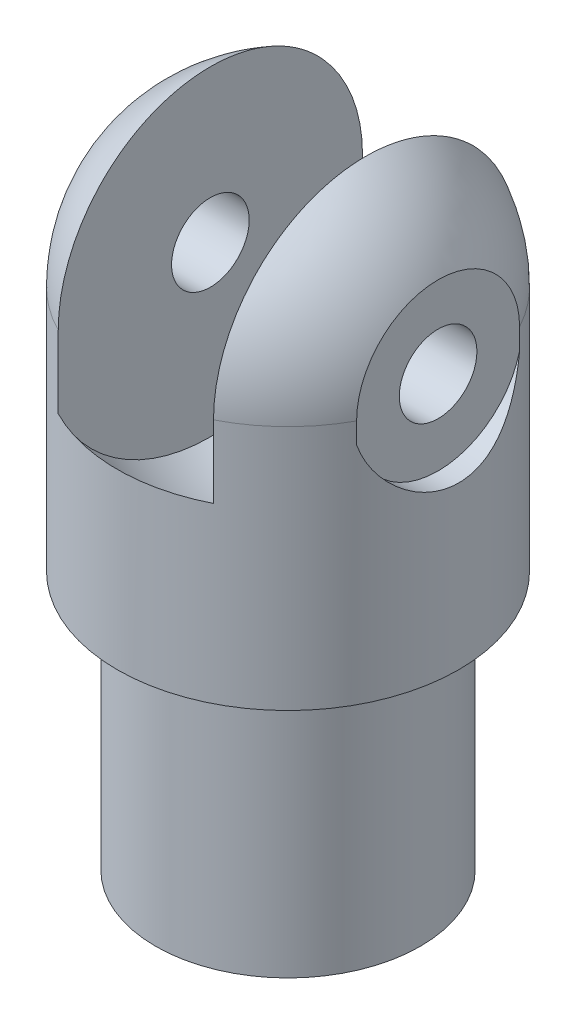
ISO-10303-21;
HEADER;
FILE_DESCRIPTION(('STEP AP214'),'2;1');
FILE_NAME('part.step','',(''),(''),'','','');
FILE_SCHEMA(('AUTOMOTIVE_DESIGN { 1 0 10303 214 1 1 1 1 }'));
ENDSEC;
DATA;
#1=APPLICATION_CONTEXT('core data for automotive mechanical design processes');
#2=APPLICATION_PROTOCOL_DEFINITION('international standard','automotive_design',2000,#1);
#3=PRODUCT_CONTEXT('',#1,'mechanical');
#4=PRODUCT('Part','Part','',(#3));
#5=PRODUCT_RELATED_PRODUCT_CATEGORY('part','',(#4));
#6=PRODUCT_DEFINITION_FORMATION('','',#4);
#7=PRODUCT_DEFINITION_CONTEXT('part definition',#1,'design');
#8=PRODUCT_DEFINITION('design','',#6,#7);
#9=PRODUCT_DEFINITION_SHAPE('','',#8);
#10=(LENGTH_UNIT() NAMED_UNIT(*) SI_UNIT(.MILLI.,.METRE.));
#11=(NAMED_UNIT(*) PLANE_ANGLE_UNIT() SI_UNIT($,.RADIAN.));
#12=(NAMED_UNIT(*) SI_UNIT($,.STERADIAN.) SOLID_ANGLE_UNIT());
#13=UNCERTAINTY_MEASURE_WITH_UNIT(LENGTH_MEASURE(1.E-05),#10,'distance_accuracy_value','');
#14=(GEOMETRIC_REPRESENTATION_CONTEXT(3) GLOBAL_UNCERTAINTY_ASSIGNED_CONTEXT((#13)) GLOBAL_UNIT_ASSIGNED_CONTEXT((#10,
#11,#12)) REPRESENTATION_CONTEXT('',''));
#15=CARTESIAN_POINT('',(0.,0.,0.));
#16=DIRECTION('',(0.,0.,1.));
#17=DIRECTION('',(1.,0.,0.));
#18=AXIS2_PLACEMENT_3D('',#15,#16,#17);
#19=CARTESIAN_POINT('',(0.,25.4,0.));
#20=DIRECTION('',(0.,-1.,0.));
#21=DIRECTION('',(0.,0.,-1.));
#22=AXIS2_PLACEMENT_3D('',#19,#20,#21);
#23=CYLINDRICAL_SURFACE('',#22,16.764);
#24=CARTESIAN_POINT('',(0.,25.4,0.));
#25=DIRECTION('',(0.,-1.,0.));
#26=DIRECTION('',(0.,0.,-1.));
#27=AXIS2_PLACEMENT_3D('',#24,#25,#26);
#28=CIRCLE('',#27,16.764);
#29=CARTESIAN_POINT('',(0.,25.4,-16.764));
#30=VERTEX_POINT('',#29);
#31=EDGE_CURVE('E155',#30,#30,#28,.T.);
#32=ORIENTED_EDGE('',*,*,#31,.F.);
#33=EDGE_LOOP('',(#32));
#34=FACE_BOUND('',#33,.T.);
#35=DIRECTION('',(0.,-1.,0.));
#36=VECTOR('',#35,1.);
#37=CARTESIAN_POINT('',(-14.732,25.4,7.99999199999601));
#38=LINE('',#37,#36);
#39=CARTESIAN_POINT('',(-14.732,49.53,7.99999199999599));
#40=VERTEX_POINT('',#39);
#41=CARTESIAN_POINT('',(-14.732,47.4940351181811,7.999991999996));
#42=VERTEX_POINT('',#41);
#43=EDGE_CURVE('E54',#40,#42,#38,.T.);
#44=ORIENTED_EDGE('',*,*,#43,.T.);
#45=CARTESIAN_POINT('',(-14.732,47.4940351181811,7.999991999996));
#46=CARTESIAN_POINT('',(-14.7632428149745,47.2676965830814,7.94241358215981));
#47=CARTESIAN_POINT('',(-14.7992408390983,47.0445110768314,7.87536493698053));
#48=CARTESIAN_POINT('',(-14.879188313626,46.6060089675617,7.72327688875927));
#49=CARTESIAN_POINT('',(-14.9231316908732,46.39068650436,7.6382512183925));
#50=CARTESIAN_POINT('',(-15.0173193540466,45.9697669038307,7.45135367046158));
#51=CARTESIAN_POINT('',(-15.0675440290785,45.7641421273517,7.34953392338279));
#52=CARTESIAN_POINT('',(-15.172784570775,45.3629649693112,7.12973781880571));
#53=CARTESIAN_POINT('',(-15.2278013555183,45.1674145292753,7.01175836291917));
#54=CARTESIAN_POINT('',(-15.3408377940109,44.7879154803039,6.7608624749813));
#55=CARTESIAN_POINT('',(-15.3988485487307,44.6039357301417,6.62798907245141));
#56=CARTESIAN_POINT('',(-15.5164536502358,44.247772245364,6.34779121039095));
#57=CARTESIAN_POINT('',(-15.576048519683,44.0755924727903,6.20046193704368));
#58=CARTESIAN_POINT('',(-15.6953215393529,43.7437713667053,5.89202328109875));
#59=CARTESIAN_POINT('',(-15.7549997161271,43.5841415256537,5.73090154380131));
#60=CARTESIAN_POINT('',(-15.8728994383717,43.2784275593615,5.39576817693684));
#61=CARTESIAN_POINT('',(-15.9311208999466,43.1323442129878,5.22175580724551));
#62=CARTESIAN_POINT('',(-16.0478628509385,42.8468007347405,4.85155017999724));
#63=CARTESIAN_POINT('',(-16.1062164025846,42.7081736847849,4.65466002551559));
#64=CARTESIAN_POINT('',(-16.2180568804278,42.4481591991597,4.24860570896111));
#65=CARTESIAN_POINT('',(-16.271545758772,42.3267648371098,4.03944652625551));
#66=CARTESIAN_POINT('',(-16.3721474970255,42.1023081457724,3.61013350428588));
#67=CARTESIAN_POINT('',(-16.419262715903,41.9992390296273,3.38998377428444));
#68=CARTESIAN_POINT('',(-16.5057477863901,41.8124944270932,2.9401400339747));
#69=CARTESIAN_POINT('',(-16.545118332013,41.7288172028441,2.71044688110503));
#70=CARTESIAN_POINT('',(-16.6128116427845,41.5862899211255,2.25731556721498));
#71=CARTESIAN_POINT('',(-16.6416555412932,41.5262514704973,2.03432900370458));
#72=CARTESIAN_POINT('',(-16.6906167773421,41.4249405685363,1.58318479412128));
#73=CARTESIAN_POINT('',(-16.710734420957,41.383667459004,1.35502732971389));
#74=CARTESIAN_POINT('',(-16.7416457550054,41.3204450568566,0.895538072447009));
#75=CARTESIAN_POINT('',(-16.752444102877,41.2984861116337,0.664207923970672));
#76=CARTESIAN_POINT('',(-16.7644091112563,41.2741622096633,0.200277254742219));
#77=CARTESIAN_POINT('',(-16.7655764400388,41.2717958934271,-0.0323231767470658));
#78=CARTESIAN_POINT('',(-16.7585774682984,41.286015963006,-0.475925150939787));
#79=CARTESIAN_POINT('',(-16.7512374738537,41.3009244339688,-0.686995954489339));
#80=CARTESIAN_POINT('',(-16.7287341668824,41.3468296178267,-1.10696138492675));
#81=CARTESIAN_POINT('',(-16.7135708234282,41.3778263943229,-1.31585600320827));
#82=CARTESIAN_POINT('',(-16.675793299344,41.4555611276885,-1.72998501250151));
#83=CARTESIAN_POINT('',(-16.6531797037887,41.5022978484928,-1.93521968959792));
#84=CARTESIAN_POINT('',(-16.6010418636704,41.6110232478168,-2.34070499905829));
#85=CARTESIAN_POINT('',(-16.5715174082148,41.6730123917843,-2.54095547911752));
#86=CARTESIAN_POINT('',(-16.5061109356301,41.8119173696252,-2.93602248687384));
#87=CARTESIAN_POINT('',(-16.4702050376366,41.8888893797212,-3.1308153054206));
#88=CARTESIAN_POINT('',(-16.3929194386841,42.0569362686502,-3.51311679042389));
#89=CARTESIAN_POINT('',(-16.351538025052,42.1480155615923,-3.70062315393017));
#90=CARTESIAN_POINT('',(-16.2204913759469,42.4413852655865,-4.25078418897575));
#91=CARTESIAN_POINT('',(-16.1238963619702,42.6638638179334,-4.60123949546831));
#92=CARTESIAN_POINT('',(-15.911072723423,43.1789899949749,-5.29262327700382));
#93=CARTESIAN_POINT('',(-15.7938609473103,43.4761316921131,-5.62990125852566));
#94=CARTESIAN_POINT('',(-15.6172315949704,43.9592130610402,-6.09602565455538));
#95=CARTESIAN_POINT('',(-15.5582044904555,44.1265164317535,-6.24480168645756));
#96=CARTESIAN_POINT('',(-15.4413018385372,44.4729525759345,-6.52850608220802));
#97=CARTESIAN_POINT('',(-15.3834263932282,44.652086392143,-6.66343322272471));
#98=CARTESIAN_POINT('',(-15.2660021267702,45.0355624724045,-6.92845533405348));
#99=CARTESIAN_POINT('',(-15.2066682552839,45.2407834857071,-7.05737592431754));
#100=CARTESIAN_POINT('',(-15.0930610282224,45.6628134689172,-7.29717698972182));
#101=CARTESIAN_POINT('',(-15.0387869161287,45.8796206988409,-7.40806016360996));
#102=CARTESIAN_POINT('',(-14.9370883073101,46.3242571421849,-7.61105063455357));
#103=CARTESIAN_POINT('',(-14.8896848786245,46.5521175119135,-7.70310052277909));
#104=CARTESIAN_POINT('',(-14.803725968713,47.016802057885,-7.8670033936605));
#105=CARTESIAN_POINT('',(-14.7651777545342,47.253633411848,-7.9388397988814));
#106=CARTESIAN_POINT('',(-14.732,47.4940351181811,-7.99999199999601));
#107=B_SPLINE_CURVE_WITH_KNOTS('',3,(#45,#46,#47,#48,#49,#50,#51,#52,#53,#54,#55,#56,#57,#58,
#59,#60,#61,#62,#63,#64,#65,#66,#67,#68,#69,#70,#71,#72,#73,#74,#75,#76,#77,#78,#79,#80,#81,#82,
#83,#84,#85,#86,#87,#88,#89,#90,#91,#92,#93,#94,#95,#96,#97,#98,#99,#100,#101,#102,#103,#104,
#105,#106),.UNSPECIFIED.,.F.,.F.,(4,2,2,2,2,2,2,2,2,2,2,2,2,2,2,2,2,2,2,2,2,2,2,2,2,2,2,2,2,2,
4),(0.,0.706505853907137,1.4124739444298,2.11629051532642,2.8202422221719,3.52221018258879,
4.2244126973953,4.92725093241565,5.63012955268697,6.37249353165079,7.11455828028312,
7.85634762598262,8.59807046836946,9.29528988206071,9.99248483870202,10.6893311610708,
11.3861291304239,12.0205410126832,12.6549554029508,13.2893199839718,13.9237039258626,
14.5605138847824,15.1975235028742,16.4710365822318,17.8583634398683,18.552385977943,
19.2464697693201,19.9940608696873,20.7415400128165,21.491264794148,22.2416026577728),.UNSPECIFIED.);
#108=CARTESIAN_POINT('',(-14.732,47.4940351181811,-7.99999199999601));
#109=VERTEX_POINT('',#108);
#110=EDGE_CURVE('E11',#42,#109,#107,.T.);
#111=ORIENTED_EDGE('',*,*,#110,.T.);
#112=DIRECTION('',(0.,-1.,0.));
#113=VECTOR('',#112,1.);
#114=CARTESIAN_POINT('',(-14.732,25.4,-7.99999199999601));
#115=LINE('',#114,#113);
#116=CARTESIAN_POINT('',(-14.732,49.53,-7.99999199999602));
#117=VERTEX_POINT('',#116);
#118=EDGE_CURVE('E111',#109,#117,#115,.F.);
#119=ORIENTED_EDGE('',*,*,#118,.T.);
#120=CARTESIAN_POINT('',(0.,49.53,0.));
#121=DIRECTION('',(0.,-1.,0.));
#122=DIRECTION('',(0.,0.,-1.));
#123=AXIS2_PLACEMENT_3D('',#120,#121,#122);
#124=CIRCLE('',#123,16.764);
#125=CARTESIAN_POINT('',(-7.62000000000001,49.53,-14.9320894720063));
#126=VERTEX_POINT('',#125);
#127=EDGE_CURVE('E159',#117,#126,#124,.T.);
#128=ORIENTED_EDGE('',*,*,#127,.T.);
#129=DIRECTION('',(0.,-1.,0.));
#130=VECTOR('',#129,1.);
#131=CARTESIAN_POINT('',(-7.62000000000001,25.4,-14.9320894720063));
#132=LINE('',#131,#130);
#133=CARTESIAN_POINT('',(-7.62,42.4289866670171,-14.9320894720063));
#134=VERTEX_POINT('',#133);
#135=EDGE_CURVE('E148',#126,#134,#132,.T.);
#136=ORIENTED_EDGE('',*,*,#135,.T.);
#137=CARTESIAN_POINT('',(0.,42.4289866670171,0.));
#138=DIRECTION('',(0.,1.,0.));
#139=DIRECTION('',(0.,0.,1.));
#140=AXIS2_PLACEMENT_3D('',#137,#138,#139);
#141=CIRCLE('',#140,16.764);
#142=CARTESIAN_POINT('',(7.61999999999999,42.4289866670171,-14.9320894720063));
#143=VERTEX_POINT('',#142);
#144=EDGE_CURVE('E175',#143,#134,#141,.T.);
#145=ORIENTED_EDGE('',*,*,#144,.F.);
#146=DIRECTION('',(0.,-1.,0.));
#147=VECTOR('',#146,1.);
#148=CARTESIAN_POINT('',(7.61999999999998,25.4,-14.9320894720063));
#149=LINE('',#148,#147);
#150=CARTESIAN_POINT('',(7.61999999999999,49.53,-14.9320894720063));
#151=VERTEX_POINT('',#150);
#152=EDGE_CURVE('E144',#143,#151,#149,.F.);
#153=ORIENTED_EDGE('',*,*,#152,.T.);
#154=CARTESIAN_POINT('',(14.732,49.53,-7.99999199999601));
#155=VERTEX_POINT('',#154);
#156=EDGE_CURVE('E158',#151,#155,#124,.T.);
#157=ORIENTED_EDGE('',*,*,#156,.T.);
#158=DIRECTION('',(0.,-1.,0.));
#159=VECTOR('',#158,1.);
#160=CARTESIAN_POINT('',(14.732,25.4,-7.99999199999601));
#161=LINE('',#160,#159);
#162=CARTESIAN_POINT('',(14.732,47.4940351181811,-7.99999199999601));
#163=VERTEX_POINT('',#162);
#164=EDGE_CURVE('E125',#155,#163,#161,.T.);
#165=ORIENTED_EDGE('',*,*,#164,.T.);
#166=CARTESIAN_POINT('',(14.732,47.4940351181811,7.999991999996));
#167=CARTESIAN_POINT('',(14.7632428149745,47.2676965830814,7.94241358215981));
#168=CARTESIAN_POINT('',(14.7992408390983,47.0445110768314,7.87536493698053));
#169=CARTESIAN_POINT('',(14.879188313626,46.6060089675617,7.72327688875927));
#170=CARTESIAN_POINT('',(14.9231316908732,46.39068650436,7.6382512183925));
#171=CARTESIAN_POINT('',(15.0173193540466,45.9697669038307,7.45135367046158));
#172=CARTESIAN_POINT('',(15.0675440290785,45.7641421273517,7.34953392338279));
#173=CARTESIAN_POINT('',(15.172784570775,45.3629649693112,7.12973781880571));
#174=CARTESIAN_POINT('',(15.2278013555183,45.1674145292753,7.01175836291917));
#175=CARTESIAN_POINT('',(15.3408377940109,44.7879154803039,6.7608624749813));
#176=CARTESIAN_POINT('',(15.3988485487307,44.6039357301417,6.62798907245141));
#177=CARTESIAN_POINT('',(15.5164536502358,44.247772245364,6.34779121039095));
#178=CARTESIAN_POINT('',(15.576048519683,44.0755924727903,6.20046193704368));
#179=CARTESIAN_POINT('',(15.6953215393529,43.7437713667053,5.89202328109875));
#180=CARTESIAN_POINT('',(15.7549997161271,43.5841415256537,5.73090154380131));
#181=CARTESIAN_POINT('',(15.8728994383717,43.2784275593615,5.39576817693684));
#182=CARTESIAN_POINT('',(15.9311208999466,43.1323442129878,5.22175580724551));
#183=CARTESIAN_POINT('',(16.0478628509385,42.8468007347405,4.85155017999724));
#184=CARTESIAN_POINT('',(16.1062164025846,42.7081736847849,4.65466002551559));
#185=CARTESIAN_POINT('',(16.2180568804278,42.4481591991597,4.24860570896111));
#186=CARTESIAN_POINT('',(16.271545758772,42.3267648371098,4.03944652625551));
#187=CARTESIAN_POINT('',(16.3721474970255,42.1023081457724,3.61013350428588));
#188=CARTESIAN_POINT('',(16.419262715903,41.9992390296273,3.38998377428444));
#189=CARTESIAN_POINT('',(16.5057477863901,41.8124944270932,2.9401400339747));
#190=CARTESIAN_POINT('',(16.545118332013,41.7288172028441,2.71044688110503));
#191=CARTESIAN_POINT('',(16.6128116427845,41.5862899211255,2.25731556721498));
#192=CARTESIAN_POINT('',(16.6416555412932,41.5262514704973,2.03432900370458));
#193=CARTESIAN_POINT('',(16.6906167773421,41.4249405685363,1.58318479412128));
#194=CARTESIAN_POINT('',(16.710734420957,41.383667459004,1.35502732971389));
#195=CARTESIAN_POINT('',(16.7416457550054,41.3204450568566,0.895538072447009));
#196=CARTESIAN_POINT('',(16.752444102877,41.2984861116337,0.664207923970672));
#197=CARTESIAN_POINT('',(16.7644091112563,41.2741622096633,0.200277254742219));
#198=CARTESIAN_POINT('',(16.7655764400388,41.2717958934271,-0.0323231767470658));
#199=CARTESIAN_POINT('',(16.7585774682984,41.286015963006,-0.475925150939787));
#200=CARTESIAN_POINT('',(16.7512374738537,41.3009244339688,-0.686995954489339));
#201=CARTESIAN_POINT('',(16.7287341668824,41.3468296178267,-1.10696138492675));
#202=CARTESIAN_POINT('',(16.7135708234282,41.3778263943229,-1.31585600320827));
#203=CARTESIAN_POINT('',(16.675793299344,41.4555611276885,-1.72998501250151));
#204=CARTESIAN_POINT('',(16.6531797037887,41.5022978484928,-1.93521968959792));
#205=CARTESIAN_POINT('',(16.6010418636704,41.6110232478168,-2.34070499905829));
#206=CARTESIAN_POINT('',(16.5715174082148,41.6730123917843,-2.54095547911752));
#207=CARTESIAN_POINT('',(16.5061109356301,41.8119173696252,-2.93602248687384));
#208=CARTESIAN_POINT('',(16.4702050376366,41.8888893797212,-3.1308153054206));
#209=CARTESIAN_POINT('',(16.3929194386841,42.0569362686502,-3.51311679042389));
#210=CARTESIAN_POINT('',(16.351538025052,42.1480155615923,-3.70062315393017));
#211=CARTESIAN_POINT('',(16.2204913759469,42.4413852655865,-4.25078418897575));
#212=CARTESIAN_POINT('',(16.1238963619702,42.6638638179334,-4.60123949546831));
#213=CARTESIAN_POINT('',(15.911072723423,43.1789899949749,-5.29262327700382));
#214=CARTESIAN_POINT('',(15.7938609473103,43.4761316921131,-5.62990125852566));
#215=CARTESIAN_POINT('',(15.6172315949704,43.9592130610402,-6.09602565455538));
#216=CARTESIAN_POINT('',(15.5582044904555,44.1265164317535,-6.24480168645756));
#217=CARTESIAN_POINT('',(15.4413018385372,44.4729525759345,-6.52850608220802));
#218=CARTESIAN_POINT('',(15.3834263932282,44.652086392143,-6.66343322272471));
#219=CARTESIAN_POINT('',(15.2660021267702,45.0355624724045,-6.92845533405348));
#220=CARTESIAN_POINT('',(15.2066682552839,45.2407834857071,-7.05737592431754));
#221=CARTESIAN_POINT('',(15.0930610282224,45.6628134689172,-7.29717698972182));
#222=CARTESIAN_POINT('',(15.0387869161287,45.8796206988409,-7.40806016360996));
#223=CARTESIAN_POINT('',(14.9370883073101,46.3242571421849,-7.61105063455357));
#224=CARTESIAN_POINT('',(14.8896848786245,46.5521175119135,-7.70310052277909));
#225=CARTESIAN_POINT('',(14.803725968713,47.016802057885,-7.8670033936605));
#226=CARTESIAN_POINT('',(14.7651777545342,47.253633411848,-7.9388397988814));
#227=CARTESIAN_POINT('',(14.732,47.4940351181811,-7.99999199999601));
#228=B_SPLINE_CURVE_WITH_KNOTS('',3,(#166,#167,#168,#169,#170,#171,#172,#173,#174,#175,#176,
#177,#178,#179,#180,#181,#182,#183,#184,#185,#186,#187,#188,#189,#190,#191,#192,#193,#194,#195,
#196,#197,#198,#199,#200,#201,#202,#203,#204,#205,#206,#207,#208,#209,#210,#211,#212,#213,#214,
#215,#216,#217,#218,#219,#220,#221,#222,#223,#224,#225,#226,#227),.UNSPECIFIED.,.F.,.F.,(4,2,2,
2,2,2,2,2,2,2,2,2,2,2,2,2,2,2,2,2,2,2,2,2,2,2,2,2,2,2,4),(0.,0.706505853907137,1.4124739444298,
2.11629051532642,2.8202422221719,3.52221018258879,4.2244126973953,4.92725093241565,
5.63012955268697,6.37249353165079,7.11455828028312,7.85634762598262,8.59807046836946,
9.29528988206071,9.99248483870202,10.6893311610708,11.3861291304239,12.0205410126832,
12.6549554029508,13.2893199839718,13.9237039258626,14.5605138847824,15.1975235028742,
16.4710365822318,17.8583634398683,18.552385977943,19.2464697693201,19.9940608696873,
20.7415400128165,21.491264794148,22.2416026577728),.UNSPECIFIED.);
#229=CARTESIAN_POINT('',(14.732,47.4940351181811,7.999991999996));
#230=VERTEX_POINT('',#229);
#231=EDGE_CURVE('E47',#230,#163,#228,.T.);
#232=ORIENTED_EDGE('',*,*,#231,.F.);
#233=DIRECTION('',(0.,-1.,0.));
#234=VECTOR('',#233,1.);
#235=CARTESIAN_POINT('',(14.732,25.4,7.99999199999601));
#236=LINE('',#235,#234);
#237=CARTESIAN_POINT('',(14.732,49.53,7.99999199999599));
#238=VERTEX_POINT('',#237);
#239=EDGE_CURVE('E130',#230,#238,#236,.F.);
#240=ORIENTED_EDGE('',*,*,#239,.T.);
#241=CARTESIAN_POINT('',(7.61999999999998,49.53,14.9320894720063));
#242=VERTEX_POINT('',#241);
#243=EDGE_CURVE('E161',#238,#242,#124,.T.);
#244=ORIENTED_EDGE('',*,*,#243,.T.);
#245=DIRECTION('',(0.,-1.,0.));
#246=VECTOR('',#245,1.);
#247=CARTESIAN_POINT('',(7.61999999999998,25.4,14.9320894720063));
#248=LINE('',#247,#246);
#249=CARTESIAN_POINT('',(7.61999999999999,42.4289866670171,14.9320894720063));
#250=VERTEX_POINT('',#249);
#251=EDGE_CURVE('E139',#242,#250,#248,.T.);
#252=ORIENTED_EDGE('',*,*,#251,.T.);
#253=CARTESIAN_POINT('',(-7.62,42.4289866670171,14.9320894720063));
#254=VERTEX_POINT('',#253);
#255=EDGE_CURVE('E165',#254,#250,#141,.T.);
#256=ORIENTED_EDGE('',*,*,#255,.F.);
#257=DIRECTION('',(0.,-1.,0.));
#258=VECTOR('',#257,1.);
#259=CARTESIAN_POINT('',(-7.62000000000001,25.4,14.9320894720063));
#260=LINE('',#259,#258);
#261=CARTESIAN_POINT('',(-7.62,49.53,14.9320894720062));
#262=VERTEX_POINT('',#261);
#263=EDGE_CURVE('E153',#254,#262,#260,.F.);
#264=ORIENTED_EDGE('',*,*,#263,.T.);
#265=EDGE_CURVE('E117',#262,#40,#124,.T.);
#266=ORIENTED_EDGE('',*,*,#265,.T.);
#267=EDGE_LOOP('',(#44,#111,#119,#128,#136,#145,#153,#157,#165,#232,#240,#244,#252,#256,#264,#266));
#268=FACE_BOUND('',#267,.T.);
#269=ADVANCED_FACE('F33',(#34,#268),#23,.T.);
#270=CARTESIAN_POINT('',(0.,49.53,0.));
#271=DIRECTION('',(0.,-1.,0.));
#272=DIRECTION('',(0.,0.,1.));
#273=AXIS2_PLACEMENT_3D('',#270,#271,#272);
#274=SPHERICAL_SURFACE('',#273,16.764);
#275=CARTESIAN_POINT('',(-14.732,49.53,0.));
#276=DIRECTION('',(-1.,0.,0.));
#277=DIRECTION('',(0.,0.,1.));
#278=AXIS2_PLACEMENT_3D('',#275,#276,#277);
#279=CIRCLE('',#278,7.99999199999601);
#280=EDGE_CURVE('E118',#40,#117,#279,.T.);
#281=ORIENTED_EDGE('',*,*,#280,.F.);
#282=ORIENTED_EDGE('',*,*,#265,.F.);
#283=CARTESIAN_POINT('',(-7.62,49.53,0.));
#284=DIRECTION('',(1.,0.,0.));
#285=DIRECTION('',(0.,1.,0.));
#286=AXIS2_PLACEMENT_3D('',#283,#284,#285);
#287=CIRCLE('',#286,14.9320894720063);
#288=EDGE_CURVE('E151',#126,#262,#287,.T.);
#289=ORIENTED_EDGE('',*,*,#288,.F.);
#290=ORIENTED_EDGE('',*,*,#127,.F.);
#291=EDGE_LOOP('',(#281,#282,#289,#290));
#292=FACE_BOUND('',#291,.T.);
#293=ADVANCED_FACE('F208',(#292),#274,.T.);
#294=CARTESIAN_POINT('',(-16.764,49.53,0.));
#295=DIRECTION('',(1.,0.,0.));
#296=DIRECTION('',(0.,0.,-1.));
#297=AXIS2_PLACEMENT_3D('',#294,#295,#296);
#298=CYLINDRICAL_SURFACE('',#297,3.81);
#299=CARTESIAN_POINT('',(-7.62,49.53,0.));
#300=DIRECTION('',(1.,0.,0.));
#301=DIRECTION('',(0.,1.,0.));
#302=AXIS2_PLACEMENT_3D('',#299,#300,#301);
#303=CIRCLE('',#302,3.81);
#304=CARTESIAN_POINT('',(-7.62,53.34,0.));
#305=VERTEX_POINT('',#304);
#306=EDGE_CURVE('E147',#305,#305,#303,.F.);
#307=ORIENTED_EDGE('',*,*,#306,.F.);
#308=EDGE_LOOP('',(#307));
#309=FACE_BOUND('',#308,.T.);
#310=CARTESIAN_POINT('',(-14.732,49.53,0.));
#311=DIRECTION('',(-1.,0.,0.));
#312=DIRECTION('',(0.,0.,1.));
#313=AXIS2_PLACEMENT_3D('',#310,#311,#312);
#314=CIRCLE('',#313,3.81);
#315=CARTESIAN_POINT('',(-14.732,49.53,3.80999999999999));
#316=VERTEX_POINT('',#315);
#317=EDGE_CURVE('E112',#316,#316,#314,.F.);
#318=ORIENTED_EDGE('',*,*,#317,.F.);
#319=EDGE_LOOP('',(#318));
#320=FACE_BOUND('',#319,.T.);
#321=ADVANCED_FACE('F205',(#309,#320),#298,.F.);
#322=CARTESIAN_POINT('',(14.732,49.53,0.));
#323=DIRECTION('',(1.,0.,0.));
#324=DIRECTION('',(0.,0.,-1.));
#325=AXIS2_PLACEMENT_3D('',#322,#323,#324);
#326=CIRCLE('',#325,7.99999199999601);
#327=EDGE_CURVE('E128',#155,#238,#326,.T.);
#328=ORIENTED_EDGE('',*,*,#327,.F.);
#329=ORIENTED_EDGE('',*,*,#156,.F.);
#330=CARTESIAN_POINT('',(7.61999999999999,49.53,0.));
#331=DIRECTION('',(-1.,0.,0.));
#332=DIRECTION('',(0.,-1.,0.));
#333=AXIS2_PLACEMENT_3D('',#330,#331,#332);
#334=CIRCLE('',#333,14.9320894720063);
#335=EDGE_CURVE('E142',#242,#151,#334,.T.);
#336=ORIENTED_EDGE('',*,*,#335,.F.);
#337=ORIENTED_EDGE('',*,*,#243,.F.);
#338=EDGE_LOOP('',(#328,#329,#336,#337));
#339=FACE_BOUND('',#338,.T.);
#340=ADVANCED_FACE('F207',(#339),#274,.T.);
#341=CARTESIAN_POINT('',(7.61999999999999,49.53,0.));
#342=DIRECTION('',(-1.,0.,0.));
#343=DIRECTION('',(0.,-1.,0.));
#344=AXIS2_PLACEMENT_3D('',#341,#342,#343);
#345=CIRCLE('',#344,3.81);
#346=CARTESIAN_POINT('',(7.61999999999999,45.72,0.));
#347=VERTEX_POINT('',#346);
#348=EDGE_CURVE('E138',#347,#347,#345,.F.);
#349=ORIENTED_EDGE('',*,*,#348,.F.);
#350=EDGE_LOOP('',(#349));
#351=FACE_BOUND('',#350,.T.);
#352=CARTESIAN_POINT('',(14.732,49.53,0.));
#353=DIRECTION('',(1.,0.,0.));
#354=DIRECTION('',(0.,0.,-1.));
#355=AXIS2_PLACEMENT_3D('',#352,#353,#354);
#356=CIRCLE('',#355,3.81);
#357=CARTESIAN_POINT('',(14.732,49.53,-3.81000000000001));
#358=VERTEX_POINT('',#357);
#359=EDGE_CURVE('E124',#358,#358,#356,.F.);
#360=ORIENTED_EDGE('',*,*,#359,.F.);
#361=EDGE_LOOP('',(#360));
#362=FACE_BOUND('',#361,.T.);
#363=ADVANCED_FACE('F210',(#351,#362),#298,.F.);
#364=CARTESIAN_POINT('',(0.,25.4,0.));
#365=DIRECTION('',(0.,-1.,0.));
#366=DIRECTION('',(0.,0.,-1.));
#367=AXIS2_PLACEMENT_3D('',#364,#365,#366);
#368=CYLINDRICAL_SURFACE('',#367,12.9921);
#369=CARTESIAN_POINT('',(0.,25.4,0.));
#370=DIRECTION('',(0.,1.,0.));
#371=DIRECTION('',(0.,0.,1.));
#372=AXIS2_PLACEMENT_3D('',#369,#370,#371);
#373=CIRCLE('',#372,12.9921);
#374=CARTESIAN_POINT('',(0.,25.4,12.9921));
#375=VERTEX_POINT('',#374);
#376=EDGE_CURVE('E162',#375,#375,#373,.T.);
#377=ORIENTED_EDGE('',*,*,#376,.F.);
#378=EDGE_LOOP('',(#377));
#379=FACE_BOUND('',#378,.T.);
#380=CARTESIAN_POINT('',(0.,0.,0.));
#381=DIRECTION('',(0.,1.,0.));
#382=DIRECTION('',(0.,0.,1.));
#383=AXIS2_PLACEMENT_3D('',#380,#381,#382);
#384=CIRCLE('',#383,12.9921);
#385=CARTESIAN_POINT('',(0.,0.,12.9921));
#386=VERTEX_POINT('',#385);
#387=EDGE_CURVE('E166',#386,#386,#384,.T.);
#388=ORIENTED_EDGE('',*,*,#387,.T.);
#389=EDGE_LOOP('',(#388));
#390=FACE_BOUND('',#389,.T.);
#391=ADVANCED_FACE('F35',(#379,#390),#368,.T.);
#392=CARTESIAN_POINT('',(0.,0.,0.));
#393=DIRECTION('',(0.,1.,0.));
#394=DIRECTION('',(0.,0.,1.));
#395=AXIS2_PLACEMENT_3D('',#392,#393,#394);
#396=PLANE('',#395);
#397=ORIENTED_EDGE('',*,*,#387,.F.);
#398=EDGE_LOOP('',(#397));
#399=FACE_BOUND('',#398,.T.);
#400=ADVANCED_FACE('F228',(#399),#396,.F.);
#401=CARTESIAN_POINT('',(0.,25.4,0.));
#402=DIRECTION('',(0.,-1.,0.));
#403=DIRECTION('',(0.,0.,-1.));
#404=AXIS2_PLACEMENT_3D('',#401,#402,#403);
#405=PLANE('',#404);
#406=ORIENTED_EDGE('',*,*,#376,.T.);
#407=EDGE_LOOP('',(#406));
#408=FACE_BOUND('',#407,.T.);
#409=ORIENTED_EDGE('',*,*,#31,.T.);
#410=EDGE_LOOP('',(#409));
#411=FACE_BOUND('',#410,.T.);
#412=ADVANCED_FACE('F203',(#408,#411),#405,.T.);
#413=CARTESIAN_POINT('',(-7.62000000000001,32.9954396382849,0.));
#414=DIRECTION('',(1.,0.,0.));
#415=DIRECTION('',(0.,1.,0.));
#416=AXIS2_PLACEMENT_3D('',#413,#414,#415);
#417=PLANE('',#416);
#418=CARTESIAN_POINT('',(-7.62,49.53,0.));
#419=DIRECTION('',(-1.,0.,0.));
#420=DIRECTION('',(0.,-1.,0.));
#421=AXIS2_PLACEMENT_3D('',#418,#419,#420);
#422=CIRCLE('',#421,16.5345603617151);
#423=EDGE_CURVE('E135',#134,#254,#422,.T.);
#424=ORIENTED_EDGE('',*,*,#423,.F.);
#425=ORIENTED_EDGE('',*,*,#135,.F.);
#426=ORIENTED_EDGE('',*,*,#288,.T.);
#427=ORIENTED_EDGE('',*,*,#263,.F.);
#428=EDGE_LOOP('',(#424,#425,#426,#427));
#429=FACE_BOUND('',#428,.T.);
#430=ORIENTED_EDGE('',*,*,#306,.T.);
#431=EDGE_LOOP('',(#430));
#432=FACE_BOUND('',#431,.T.);
#433=ADVANCED_FACE('F197',(#429,#432),#417,.T.);
#434=CARTESIAN_POINT('',(7.61999999999999,49.53,0.));
#435=DIRECTION('',(-1.,0.,0.));
#436=DIRECTION('',(0.,-1.,0.));
#437=AXIS2_PLACEMENT_3D('',#434,#435,#436);
#438=PLANE('',#437);
#439=CARTESIAN_POINT('',(7.61999999999999,49.53,0.));
#440=DIRECTION('',(-1.,0.,0.));
#441=DIRECTION('',(0.,-1.,0.));
#442=AXIS2_PLACEMENT_3D('',#439,#440,#441);
#443=CIRCLE('',#442,16.5345603617151);
#444=EDGE_CURVE('E133',#143,#250,#443,.T.);
#445=ORIENTED_EDGE('',*,*,#444,.T.);
#446=ORIENTED_EDGE('',*,*,#251,.F.);
#447=ORIENTED_EDGE('',*,*,#335,.T.);
#448=ORIENTED_EDGE('',*,*,#152,.F.);
#449=EDGE_LOOP('',(#445,#446,#447,#448));
#450=FACE_BOUND('',#449,.T.);
#451=ORIENTED_EDGE('',*,*,#348,.T.);
#452=EDGE_LOOP('',(#451));
#453=FACE_BOUND('',#452,.T.);
#454=ADVANCED_FACE('F193',(#450,#453),#438,.T.);
#455=CARTESIAN_POINT('',(0.,49.53,0.));
#456=DIRECTION('',(-1.,0.,0.));
#457=DIRECTION('',(0.,-1.,0.));
#458=AXIS2_PLACEMENT_3D('',#455,#456,#457);
#459=SPHERICAL_SURFACE('',#458,18.2059354704778);
#460=ORIENTED_EDGE('',*,*,#144,.T.);
#461=ORIENTED_EDGE('',*,*,#423,.T.);
#462=ORIENTED_EDGE('',*,*,#255,.T.);
#463=ORIENTED_EDGE('',*,*,#444,.F.);
#464=EDGE_LOOP('',(#460,#461,#462,#463));
#465=FACE_BOUND('',#464,.T.);
#466=ADVANCED_FACE('F196',(#465),#459,.F.);
#467=CARTESIAN_POINT('',(14.732,49.53,0.));
#468=DIRECTION('',(1.,0.,0.));
#469=DIRECTION('',(0.,0.,-1.));
#470=AXIS2_PLACEMENT_3D('',#467,#468,#469);
#471=PLANE('',#470);
#472=CARTESIAN_POINT('',(14.732,49.53,0.));
#473=DIRECTION('',(1.,0.,0.));
#474=DIRECTION('',(0.,0.,-1.));
#475=AXIS2_PLACEMENT_3D('',#472,#473,#474);
#476=CIRCLE('',#475,8.255);
#477=EDGE_CURVE('E62',#230,#163,#476,.T.);
#478=ORIENTED_EDGE('',*,*,#477,.T.);
#479=ORIENTED_EDGE('',*,*,#164,.F.);
#480=ORIENTED_EDGE('',*,*,#327,.T.);
#481=ORIENTED_EDGE('',*,*,#239,.F.);
#482=EDGE_LOOP('',(#478,#479,#480,#481));
#483=FACE_BOUND('',#482,.T.);
#484=ORIENTED_EDGE('',*,*,#359,.T.);
#485=EDGE_LOOP('',(#484));
#486=FACE_BOUND('',#485,.T.);
#487=ADVANCED_FACE('F191',(#483,#486),#471,.T.);
#488=CARTESIAN_POINT('',(14.732,49.53,0.));
#489=DIRECTION('',(1.,0.,0.));
#490=DIRECTION('',(0.,0.,-1.));
#491=AXIS2_PLACEMENT_3D('',#488,#489,#490);
#492=CYLINDRICAL_SURFACE('',#491,8.255);
#493=ORIENTED_EDGE('',*,*,#477,.F.);
#494=ORIENTED_EDGE('',*,*,#231,.T.);
#495=EDGE_LOOP('',(#493,#494));
#496=FACE_BOUND('',#495,.T.);
#497=ADVANCED_FACE('F186',(#496),#492,.F.);
#498=CARTESIAN_POINT('',(-14.732,49.53,0.));
#499=DIRECTION('',(-1.,0.,0.));
#500=DIRECTION('',(0.,0.,-1.));
#501=AXIS2_PLACEMENT_3D('',#498,#499,#500);
#502=PLANE('',#501);
#503=CARTESIAN_POINT('',(-14.732,49.53,0.));
#504=DIRECTION('',(1.,0.,0.));
#505=DIRECTION('',(0.,0.,-1.));
#506=AXIS2_PLACEMENT_3D('',#503,#504,#505);
#507=CIRCLE('',#506,8.255);
#508=EDGE_CURVE('E106',#42,#109,#507,.T.);
#509=ORIENTED_EDGE('',*,*,#508,.F.);
#510=ORIENTED_EDGE('',*,*,#43,.F.);
#511=ORIENTED_EDGE('',*,*,#280,.T.);
#512=ORIENTED_EDGE('',*,*,#118,.F.);
#513=EDGE_LOOP('',(#509,#510,#511,#512));
#514=FACE_BOUND('',#513,.T.);
#515=ORIENTED_EDGE('',*,*,#317,.T.);
#516=EDGE_LOOP('',(#515));
#517=FACE_BOUND('',#516,.T.);
#518=ADVANCED_FACE('F109',(#514,#517),#502,.T.);
#519=CARTESIAN_POINT('',(-14.732,49.53,0.));
#520=DIRECTION('',(-1.,0.,0.));
#521=DIRECTION('',(0.,0.,1.));
#522=AXIS2_PLACEMENT_3D('',#519,#520,#521);
#523=CYLINDRICAL_SURFACE('',#522,8.255);
#524=ORIENTED_EDGE('',*,*,#508,.T.);
#525=ORIENTED_EDGE('',*,*,#110,.F.);
#526=EDGE_LOOP('',(#524,#525));
#527=FACE_BOUND('',#526,.T.);
#528=ADVANCED_FACE('F105',(#527),#523,.F.);
#529=CLOSED_SHELL('',(#269,#293,#321,#340,#363,#391,#400,#412,#433,#454,#466,#487,#497,#518,#528));
#530=MANIFOLD_SOLID_BREP('B2',#529);
#531=ADVANCED_BREP_SHAPE_REPRESENTATION('',(#18,#530),#14);
#532=SHAPE_DEFINITION_REPRESENTATION(#9,#531);
ENDSEC;
END-ISO-10303-21;
